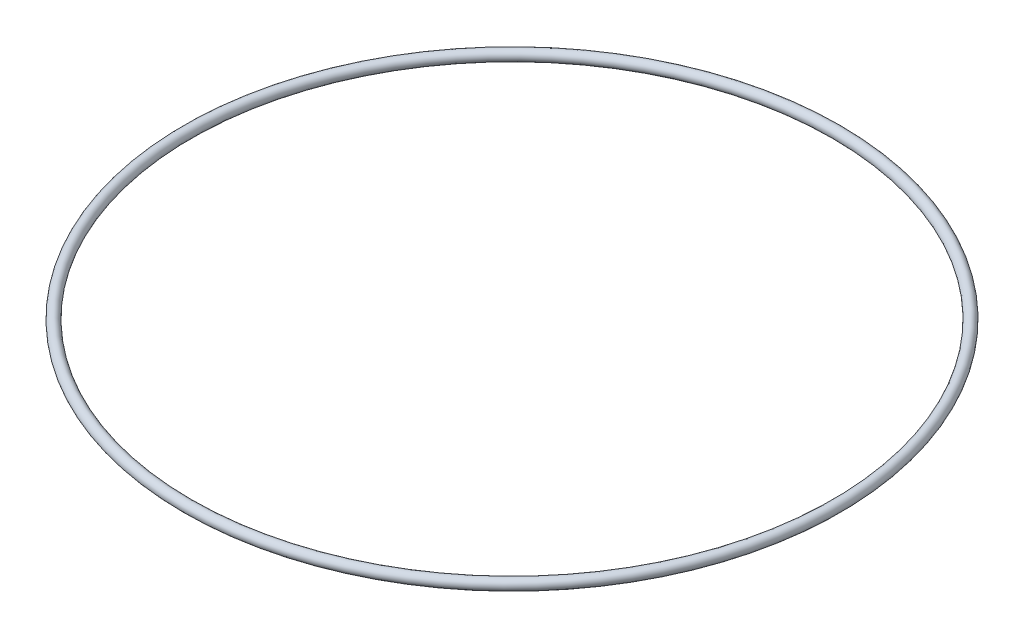
ISO-10303-21;
HEADER;
FILE_DESCRIPTION(('STEP AP214'),'2;1');
FILE_NAME('part.step','',(''),(''),'','','');
FILE_SCHEMA(('AUTOMOTIVE_DESIGN { 1 0 10303 214 1 1 1 1 }'));
ENDSEC;
DATA;
#1=APPLICATION_CONTEXT('core data for automotive mechanical design processes');
#2=APPLICATION_PROTOCOL_DEFINITION('international standard','automotive_design',2000,#1);
#3=PRODUCT_CONTEXT('',#1,'mechanical');
#4=PRODUCT('Part','Part','',(#3));
#5=PRODUCT_RELATED_PRODUCT_CATEGORY('part','',(#4));
#6=PRODUCT_DEFINITION_FORMATION('','',#4);
#7=PRODUCT_DEFINITION_CONTEXT('part definition',#1,'design');
#8=PRODUCT_DEFINITION('design','',#6,#7);
#9=PRODUCT_DEFINITION_SHAPE('','',#8);
#10=(LENGTH_UNIT() NAMED_UNIT(*) SI_UNIT(.MILLI.,.METRE.));
#11=(NAMED_UNIT(*) PLANE_ANGLE_UNIT() SI_UNIT($,.RADIAN.));
#12=(NAMED_UNIT(*) SI_UNIT($,.STERADIAN.) SOLID_ANGLE_UNIT());
#13=UNCERTAINTY_MEASURE_WITH_UNIT(LENGTH_MEASURE(1.E-05),#10,'distance_accuracy_value','');
#14=(GEOMETRIC_REPRESENTATION_CONTEXT(3) GLOBAL_UNCERTAINTY_ASSIGNED_CONTEXT((#13)) GLOBAL_UNIT_ASSIGNED_CONTEXT((#10,
#11,#12)) REPRESENTATION_CONTEXT('',''));
#15=CARTESIAN_POINT('',(0.,0.,0.));
#16=DIRECTION('',(0.,0.,1.));
#17=DIRECTION('',(1.,0.,0.));
#18=AXIS2_PLACEMENT_3D('',#15,#16,#17);
#19=CARTESIAN_POINT('',(0.,0.,0.));
#20=DIRECTION('',(0.,-1.,0.));
#21=DIRECTION('',(0.,0.,-1.));
#22=AXIS2_PLACEMENT_3D('',#19,#20,#21);
#23=TOROIDAL_SURFACE('',#22,96.8375,1.58749999999999);
#24=CARTESIAN_POINT('',(0.,0.,-98.425));
#25=VERTEX_POINT('',#24);
#26=VERTEX_LOOP('',#25);
#27=FACE_BOUND('',#26,.T.);
#28=ADVANCED_FACE('F29',(#27),#23,.T.);
#29=CLOSED_SHELL('',(#28));
#30=MANIFOLD_SOLID_BREP('B2',#29);
#31=ADVANCED_BREP_SHAPE_REPRESENTATION('',(#18,#30),#14);
#32=SHAPE_DEFINITION_REPRESENTATION(#9,#31);
ENDSEC;
END-ISO-10303-21;
